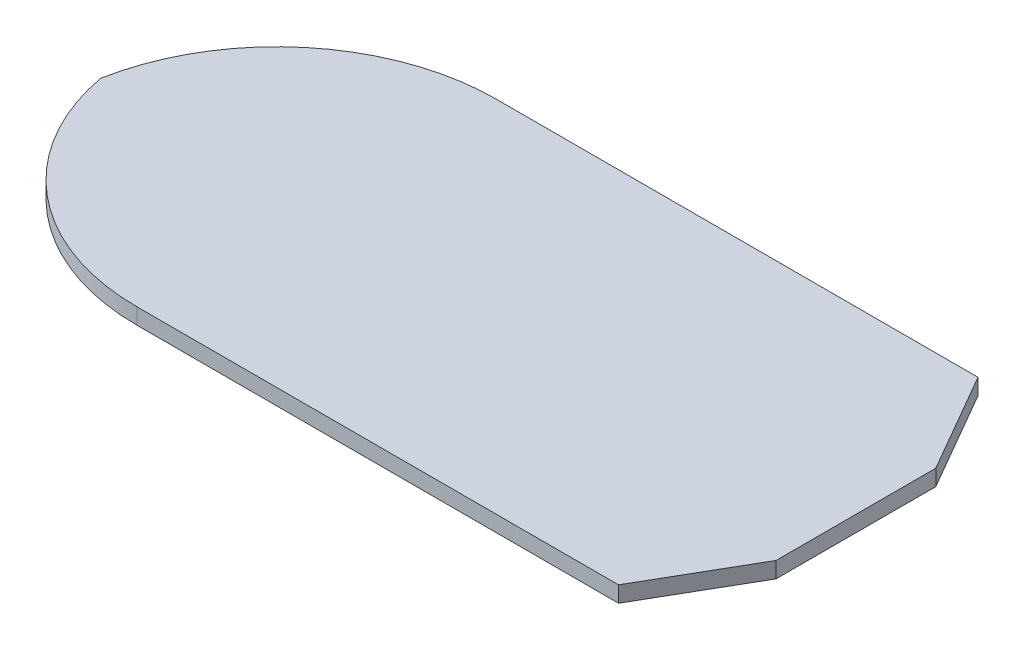
ISO-10303-21;
HEADER;
FILE_DESCRIPTION(('STEP AP214'),'2;1');
FILE_NAME('part.step','',(''),(''),'','','');
FILE_SCHEMA(('AUTOMOTIVE_DESIGN { 1 0 10303 214 1 1 1 1 }'));
ENDSEC;
DATA;
#1=APPLICATION_CONTEXT('core data for automotive mechanical design processes');
#2=APPLICATION_PROTOCOL_DEFINITION('international standard','automotive_design',2000,#1);
#3=PRODUCT_CONTEXT('',#1,'mechanical');
#4=PRODUCT('Part','Part','',(#3));
#5=PRODUCT_RELATED_PRODUCT_CATEGORY('part','',(#4));
#6=PRODUCT_DEFINITION_FORMATION('','',#4);
#7=PRODUCT_DEFINITION_CONTEXT('part definition',#1,'design');
#8=PRODUCT_DEFINITION('design','',#6,#7);
#9=PRODUCT_DEFINITION_SHAPE('','',#8);
#10=(LENGTH_UNIT() NAMED_UNIT(*) SI_UNIT(.MILLI.,.METRE.));
#11=(NAMED_UNIT(*) PLANE_ANGLE_UNIT() SI_UNIT($,.RADIAN.));
#12=(NAMED_UNIT(*) SI_UNIT($,.STERADIAN.) SOLID_ANGLE_UNIT());
#13=UNCERTAINTY_MEASURE_WITH_UNIT(LENGTH_MEASURE(1.E-05),#10,'distance_accuracy_value','');
#14=(GEOMETRIC_REPRESENTATION_CONTEXT(3) GLOBAL_UNCERTAINTY_ASSIGNED_CONTEXT((#13)) GLOBAL_UNIT_ASSIGNED_CONTEXT((#10,
#11,#12)) REPRESENTATION_CONTEXT('',''));
#15=CARTESIAN_POINT('',(0.,0.,0.));
#16=DIRECTION('',(0.,0.,1.));
#17=DIRECTION('',(1.,0.,0.));
#18=AXIS2_PLACEMENT_3D('',#15,#16,#17);
#19=CARTESIAN_POINT('',(-95.,4.,45.));
#20=DIRECTION('',(0.,0.,-1.));
#21=DIRECTION('',(-1.,0.,0.));
#22=AXIS2_PLACEMENT_3D('',#19,#20,#21);
#23=PLANE('',#22);
#24=DIRECTION('',(1.,0.,0.));
#25=VECTOR('',#24,1.);
#26=CARTESIAN_POINT('',(-95.,0.,45.));
#27=LINE('',#26,#25);
#28=CARTESIAN_POINT('',(-40.,0.,45.));
#29=VERTEX_POINT('',#28);
#30=CARTESIAN_POINT('',(80.5662432702593,0.,45.));
#31=VERTEX_POINT('',#30);
#32=EDGE_CURVE('E109',#29,#31,#27,.T.);
#33=ORIENTED_EDGE('',*,*,#32,.T.);
#34=DIRECTION('',(0.,1.,0.));
#35=VECTOR('',#34,1.);
#36=CARTESIAN_POINT('',(80.5662432702593,4.,45.));
#37=LINE('',#36,#35);
#38=CARTESIAN_POINT('',(80.5662432702593,4.,45.));
#39=VERTEX_POINT('',#38);
#40=EDGE_CURVE('E56',#31,#39,#37,.T.);
#41=ORIENTED_EDGE('',*,*,#40,.T.);
#42=DIRECTION('',(1.,0.,0.));
#43=VECTOR('',#42,1.);
#44=CARTESIAN_POINT('',(-95.,4.,45.));
#45=LINE('',#44,#43);
#46=CARTESIAN_POINT('',(-40.,4.,45.));
#47=VERTEX_POINT('',#46);
#48=EDGE_CURVE('E110',#47,#39,#45,.T.);
#49=ORIENTED_EDGE('',*,*,#48,.F.);
#50=DIRECTION('',(0.,-1.,0.));
#51=VECTOR('',#50,1.);
#52=CARTESIAN_POINT('',(-40.,0.,45.));
#53=LINE('',#52,#51);
#54=EDGE_CURVE('E100',#47,#29,#53,.T.);
#55=ORIENTED_EDGE('',*,*,#54,.T.);
#56=EDGE_LOOP('',(#33,#41,#49,#55));
#57=FACE_BOUND('',#56,.T.);
#58=ADVANCED_FACE('F33',(#57),#23,.F.);
#59=CARTESIAN_POINT('',(95.,4.,45.));
#60=DIRECTION('',(-1.,0.,0.));
#61=DIRECTION('',(0.,0.,1.));
#62=AXIS2_PLACEMENT_3D('',#59,#60,#61);
#63=PLANE('',#62);
#64=DIRECTION('',(0.,0.,-1.));
#65=VECTOR('',#64,1.);
#66=CARTESIAN_POINT('',(95.,4.,45.));
#67=LINE('',#66,#65);
#68=CARTESIAN_POINT('',(95.,4.,19.9999999999999));
#69=VERTEX_POINT('',#68);
#70=CARTESIAN_POINT('',(95.,4.,-19.9999999999998));
#71=VERTEX_POINT('',#70);
#72=EDGE_CURVE('E118',#69,#71,#67,.T.);
#73=ORIENTED_EDGE('',*,*,#72,.F.);
#74=DIRECTION('',(0.,-1.,0.));
#75=VECTOR('',#74,1.);
#76=CARTESIAN_POINT('',(95.,4.,19.9999999999999));
#77=LINE('',#76,#75);
#78=CARTESIAN_POINT('',(95.,0.,19.9999999999999));
#79=VERTEX_POINT('',#78);
#80=EDGE_CURVE('E134',#69,#79,#77,.T.);
#81=ORIENTED_EDGE('',*,*,#80,.T.);
#82=DIRECTION('',(0.,0.,-1.));
#83=VECTOR('',#82,1.);
#84=CARTESIAN_POINT('',(95.,0.,45.));
#85=LINE('',#84,#83);
#86=CARTESIAN_POINT('',(95.,0.,-19.9999999999998));
#87=VERTEX_POINT('',#86);
#88=EDGE_CURVE('E116',#79,#87,#85,.T.);
#89=ORIENTED_EDGE('',*,*,#88,.T.);
#90=DIRECTION('',(0.,1.,0.));
#91=VECTOR('',#90,1.);
#92=CARTESIAN_POINT('',(95.,4.,-19.9999999999999));
#93=LINE('',#92,#91);
#94=EDGE_CURVE('E131',#87,#71,#93,.T.);
#95=ORIENTED_EDGE('',*,*,#94,.T.);
#96=EDGE_LOOP('',(#73,#81,#89,#95));
#97=FACE_BOUND('',#96,.T.);
#98=ADVANCED_FACE('F147',(#97),#63,.F.);
#99=CARTESIAN_POINT('',(-95.,4.,-45.));
#100=DIRECTION('',(0.,0.,-1.));
#101=DIRECTION('',(-1.,0.,0.));
#102=AXIS2_PLACEMENT_3D('',#99,#100,#101);
#103=PLANE('',#102);
#104=DIRECTION('',(1.,0.,0.));
#105=VECTOR('',#104,1.);
#106=CARTESIAN_POINT('',(-95.,4.,-45.));
#107=LINE('',#106,#105);
#108=CARTESIAN_POINT('',(-40.,4.,-45.));
#109=VERTEX_POINT('',#108);
#110=CARTESIAN_POINT('',(80.5662432702593,4.,-45.));
#111=VERTEX_POINT('',#110);
#112=EDGE_CURVE('E115',#109,#111,#107,.T.);
#113=ORIENTED_EDGE('',*,*,#112,.T.);
#114=DIRECTION('',(0.,-1.,0.));
#115=VECTOR('',#114,1.);
#116=CARTESIAN_POINT('',(80.5662432702593,0.,-45.));
#117=LINE('',#116,#115);
#118=CARTESIAN_POINT('',(80.5662432702593,0.,-45.));
#119=VERTEX_POINT('',#118);
#120=EDGE_CURVE('E11',#111,#119,#117,.T.);
#121=ORIENTED_EDGE('',*,*,#120,.T.);
#122=DIRECTION('',(1.,0.,0.));
#123=VECTOR('',#122,1.);
#124=CARTESIAN_POINT('',(-95.,0.,-45.));
#125=LINE('',#124,#123);
#126=CARTESIAN_POINT('',(-40.,0.,-45.));
#127=VERTEX_POINT('',#126);
#128=EDGE_CURVE('E121',#127,#119,#125,.T.);
#129=ORIENTED_EDGE('',*,*,#128,.F.);
#130=DIRECTION('',(0.,-1.,0.));
#131=VECTOR('',#130,1.);
#132=CARTESIAN_POINT('',(-40.,4.,-45.));
#133=LINE('',#132,#131);
#134=EDGE_CURVE('E129',#127,#109,#133,.F.);
#135=ORIENTED_EDGE('',*,*,#134,.T.);
#136=EDGE_LOOP('',(#113,#121,#129,#135));
#137=FACE_BOUND('',#136,.T.);
#138=ADVANCED_FACE('F165',(#137),#103,.T.);
#139=CARTESIAN_POINT('',(0.,4.,0.));
#140=DIRECTION('',(0.,-1.,0.));
#141=DIRECTION('',(0.,0.,-1.));
#142=AXIS2_PLACEMENT_3D('',#139,#140,#141);
#143=PLANE('',#142);
#144=ORIENTED_EDGE('',*,*,#48,.T.);
#145=DIRECTION('',(-0.499999999999998,0.,0.86602540378444));
#146=VECTOR('',#145,1.);
#147=CARTESIAN_POINT('',(95.,4.,19.9999999999999));
#148=LINE('',#147,#146);
#149=EDGE_CURVE('E41',#39,#69,#148,.F.);
#150=ORIENTED_EDGE('',*,*,#149,.T.);
#151=ORIENTED_EDGE('',*,*,#72,.T.);
#152=DIRECTION('',(-0.499999999999998,0.,-0.86602540378444));
#153=VECTOR('',#152,1.);
#154=CARTESIAN_POINT('',(80.5662432702593,4.,-45.));
#155=LINE('',#154,#153);
#156=EDGE_CURVE('E48',#71,#111,#155,.T.);
#157=ORIENTED_EDGE('',*,*,#156,.T.);
#158=ORIENTED_EDGE('',*,*,#112,.F.);
#159=CARTESIAN_POINT('',(-40.,4.,10.));
#160=DIRECTION('',(0.,-1.,0.));
#161=DIRECTION('',(0.,0.,-1.));
#162=AXIS2_PLACEMENT_3D('',#159,#160,#161);
#163=CIRCLE('',#162,55.);
#164=CARTESIAN_POINT('',(-94.0832691319598,4.,0.));
#165=VERTEX_POINT('',#164);
#166=EDGE_CURVE('E106',#109,#165,#163,.F.);
#167=ORIENTED_EDGE('',*,*,#166,.T.);
#168=CARTESIAN_POINT('',(-40.,4.,-10.));
#169=DIRECTION('',(0.,-1.,0.));
#170=DIRECTION('',(0.,0.,-1.));
#171=AXIS2_PLACEMENT_3D('',#168,#169,#170);
#172=CIRCLE('',#171,55.);
#173=EDGE_CURVE('E127',#165,#47,#172,.F.);
#174=ORIENTED_EDGE('',*,*,#173,.T.);
#175=EDGE_LOOP('',(#144,#150,#151,#157,#158,#167,#174));
#176=FACE_BOUND('',#175,.T.);
#177=ADVANCED_FACE('F143',(#176),#143,.F.);
#178=CARTESIAN_POINT('',(0.,0.,0.));
#179=DIRECTION('',(0.,-1.,0.));
#180=DIRECTION('',(0.,0.,-1.));
#181=AXIS2_PLACEMENT_3D('',#178,#179,#180);
#182=PLANE('',#181);
#183=ORIENTED_EDGE('',*,*,#88,.F.);
#184=DIRECTION('',(0.499999999999998,0.,-0.86602540378444));
#185=VECTOR('',#184,1.);
#186=CARTESIAN_POINT('',(79.9102540378445,0.,46.1362066797607));
#187=LINE('',#186,#185);
#188=EDGE_CURVE('E114',#79,#31,#187,.F.);
#189=ORIENTED_EDGE('',*,*,#188,.T.);
#190=ORIENTED_EDGE('',*,*,#32,.F.);
#191=CARTESIAN_POINT('',(-40.,0.,-10.));
#192=DIRECTION('',(0.,-1.,0.));
#193=DIRECTION('',(0.,0.,-1.));
#194=AXIS2_PLACEMENT_3D('',#191,#192,#193);
#195=CIRCLE('',#194,55.);
#196=CARTESIAN_POINT('',(-94.0832691319598,0.,0.));
#197=VERTEX_POINT('',#196);
#198=EDGE_CURVE('E96',#29,#197,#195,.T.);
#199=ORIENTED_EDGE('',*,*,#198,.T.);
#200=CARTESIAN_POINT('',(-40.,0.,10.));
#201=DIRECTION('',(0.,-1.,0.));
#202=DIRECTION('',(0.,0.,-1.));
#203=AXIS2_PLACEMENT_3D('',#200,#201,#202);
#204=CIRCLE('',#203,55.);
#205=EDGE_CURVE('E107',#197,#127,#204,.T.);
#206=ORIENTED_EDGE('',*,*,#205,.T.);
#207=ORIENTED_EDGE('',*,*,#128,.T.);
#208=DIRECTION('',(0.499999999999998,0.,0.86602540378444));
#209=VECTOR('',#208,1.);
#210=CARTESIAN_POINT('',(79.9102540378445,0.,-46.1362066797607));
#211=LINE('',#210,#209);
#212=EDGE_CURVE('E137',#119,#87,#211,.T.);
#213=ORIENTED_EDGE('',*,*,#212,.T.);
#214=EDGE_LOOP('',(#183,#189,#190,#199,#206,#207,#213));
#215=FACE_BOUND('',#214,.T.);
#216=ADVANCED_FACE('F113',(#215),#182,.T.);
#217=CARTESIAN_POINT('',(-40.,4.,10.));
#218=DIRECTION('',(0.,-1.,0.));
#219=DIRECTION('',(0.,0.,-1.));
#220=AXIS2_PLACEMENT_3D('',#217,#218,#219);
#221=CYLINDRICAL_SURFACE('',#220,55.);
#222=DIRECTION('',(0.,-1.,0.));
#223=VECTOR('',#222,1.);
#224=CARTESIAN_POINT('',(-94.0832691319598,2.,0.));
#225=LINE('',#224,#223);
#226=EDGE_CURVE('E102',#165,#197,#225,.T.);
#227=ORIENTED_EDGE('',*,*,#226,.F.);
#228=ORIENTED_EDGE('',*,*,#166,.F.);
#229=ORIENTED_EDGE('',*,*,#134,.F.);
#230=ORIENTED_EDGE('',*,*,#205,.F.);
#231=EDGE_LOOP('',(#227,#228,#229,#230));
#232=FACE_BOUND('',#231,.T.);
#233=ADVANCED_FACE('F157',(#232),#221,.T.);
#234=CARTESIAN_POINT('',(-40.,4.,-10.));
#235=DIRECTION('',(0.,1.,0.));
#236=DIRECTION('',(0.,0.,1.));
#237=AXIS2_PLACEMENT_3D('',#234,#235,#236);
#238=CYLINDRICAL_SURFACE('',#237,55.);
#239=ORIENTED_EDGE('',*,*,#173,.F.);
#240=ORIENTED_EDGE('',*,*,#226,.T.);
#241=ORIENTED_EDGE('',*,*,#198,.F.);
#242=ORIENTED_EDGE('',*,*,#54,.F.);
#243=EDGE_LOOP('',(#239,#240,#241,#242));
#244=FACE_BOUND('',#243,.T.);
#245=ADVANCED_FACE('F99',(#244),#238,.T.);
#246=CARTESIAN_POINT('',(95.,4.,19.9999999999999));
#247=DIRECTION('',(-0.86602540378444,0.,-0.499999999999998));
#248=DIRECTION('',(0.,-1.,0.));
#249=AXIS2_PLACEMENT_3D('',#246,#247,#248);
#250=PLANE('',#249);
#251=ORIENTED_EDGE('',*,*,#149,.F.);
#252=ORIENTED_EDGE('',*,*,#40,.F.);
#253=ORIENTED_EDGE('',*,*,#188,.F.);
#254=ORIENTED_EDGE('',*,*,#80,.F.);
#255=EDGE_LOOP('',(#251,#252,#253,#254));
#256=FACE_BOUND('',#255,.T.);
#257=ADVANCED_FACE('F150',(#256),#250,.F.);
#258=CARTESIAN_POINT('',(80.5662432702593,4.,-45.));
#259=DIRECTION('',(0.86602540378444,0.,-0.499999999999998));
#260=DIRECTION('',(0.,1.,0.));
#261=AXIS2_PLACEMENT_3D('',#258,#259,#260);
#262=PLANE('',#261);
#263=ORIENTED_EDGE('',*,*,#156,.F.);
#264=ORIENTED_EDGE('',*,*,#94,.F.);
#265=ORIENTED_EDGE('',*,*,#212,.F.);
#266=ORIENTED_EDGE('',*,*,#120,.F.);
#267=EDGE_LOOP('',(#263,#264,#265,#266));
#268=FACE_BOUND('',#267,.T.);
#269=ADVANCED_FACE('F35',(#268),#262,.T.);
#270=CLOSED_SHELL('',(#58,#98,#138,#177,#216,#233,#245,#257,#269));
#271=MANIFOLD_SOLID_BREP('B2',#270);
#272=ADVANCED_BREP_SHAPE_REPRESENTATION('',(#18,#271),#14);
#273=SHAPE_DEFINITION_REPRESENTATION(#9,#272);
ENDSEC;
END-ISO-10303-21;
